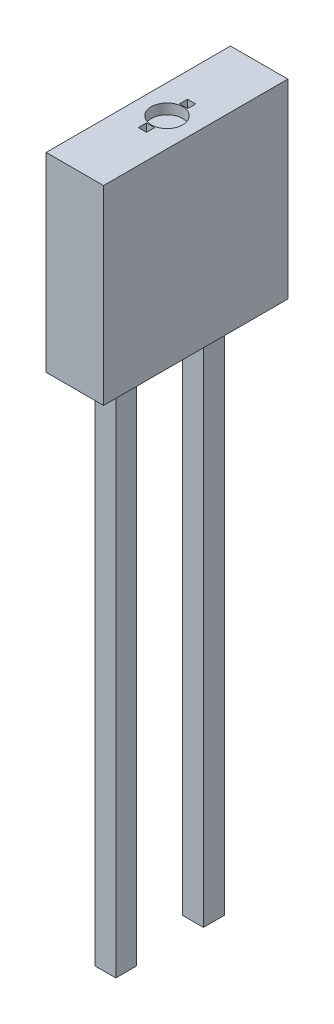
ISO-10303-21;
HEADER;
FILE_DESCRIPTION(('STEP AP214'),'2;1');
FILE_NAME('part.step','',(''),(''),'','','');
FILE_SCHEMA(('AUTOMOTIVE_DESIGN { 1 0 10303 214 1 1 1 1 }'));
ENDSEC;
DATA;
#1=APPLICATION_CONTEXT('core data for automotive mechanical design processes');
#2=APPLICATION_PROTOCOL_DEFINITION('international standard','automotive_design',2000,#1);
#3=PRODUCT_CONTEXT('',#1,'mechanical');
#4=PRODUCT('Part','Part','',(#3));
#5=PRODUCT_RELATED_PRODUCT_CATEGORY('part','',(#4));
#6=PRODUCT_DEFINITION_FORMATION('','',#4);
#7=PRODUCT_DEFINITION_CONTEXT('part definition',#1,'design');
#8=PRODUCT_DEFINITION('design','',#6,#7);
#9=PRODUCT_DEFINITION_SHAPE('','',#8);
#10=(LENGTH_UNIT() NAMED_UNIT(*) SI_UNIT(.MILLI.,.METRE.));
#11=(NAMED_UNIT(*) PLANE_ANGLE_UNIT() SI_UNIT($,.RADIAN.));
#12=(NAMED_UNIT(*) SI_UNIT($,.STERADIAN.) SOLID_ANGLE_UNIT());
#13=UNCERTAINTY_MEASURE_WITH_UNIT(LENGTH_MEASURE(1.E-05),#10,'distance_accuracy_value','');
#14=(GEOMETRIC_REPRESENTATION_CONTEXT(3) GLOBAL_UNCERTAINTY_ASSIGNED_CONTEXT((#13)) GLOBAL_UNIT_ASSIGNED_CONTEXT((#10,
#11,#12)) REPRESENTATION_CONTEXT('',''));
#15=CARTESIAN_POINT('',(0.,0.,0.));
#16=DIRECTION('',(0.,0.,1.));
#17=DIRECTION('',(1.,0.,0.));
#18=AXIS2_PLACEMENT_3D('',#15,#16,#17);
#19=CARTESIAN_POINT('',(-1.39999999999999,0.,4.5));
#20=DIRECTION('',(0.,1.,0.));
#21=DIRECTION('',(0.,0.,1.));
#22=AXIS2_PLACEMENT_3D('',#19,#20,#21);
#23=PLANE('',#22);
#24=DIRECTION('',(0.,0.,-1.));
#25=VECTOR('',#24,1.);
#26=CARTESIAN_POINT('',(-0.954999999999984,0.,3.755));
#27=LINE('',#26,#25);
#28=CARTESIAN_POINT('',(-0.954999999999984,0.,3.755));
#29=VERTEX_POINT('',#28);
#30=CARTESIAN_POINT('',(-0.954999999999984,0.,3.245));
#31=VERTEX_POINT('',#30);
#32=EDGE_CURVE('E193',#29,#31,#27,.T.);
#33=ORIENTED_EDGE('',*,*,#32,.F.);
#34=DIRECTION('',(-1.,0.,0.));
#35=VECTOR('',#34,1.);
#36=CARTESIAN_POINT('',(-0.444999999999987,0.,3.755));
#37=LINE('',#36,#35);
#38=CARTESIAN_POINT('',(-0.444999999999987,0.,3.755));
#39=VERTEX_POINT('',#38);
#40=EDGE_CURVE('E206',#39,#29,#37,.T.);
#41=ORIENTED_EDGE('',*,*,#40,.F.);
#42=DIRECTION('',(0.,0.,1.));
#43=VECTOR('',#42,1.);
#44=CARTESIAN_POINT('',(-0.444999999999987,0.,3.755));
#45=LINE('',#44,#43);
#46=CARTESIAN_POINT('',(-0.444999999999987,0.,3.245));
#47=VERTEX_POINT('',#46);
#48=EDGE_CURVE('E215',#47,#39,#45,.T.);
#49=ORIENTED_EDGE('',*,*,#48,.F.);
#50=DIRECTION('',(1.,0.,0.));
#51=VECTOR('',#50,1.);
#52=CARTESIAN_POINT('',(-0.444999999999987,0.,3.245));
#53=LINE('',#52,#51);
#54=EDGE_CURVE('E196',#31,#47,#53,.T.);
#55=ORIENTED_EDGE('',*,*,#54,.F.);
#56=EDGE_LOOP('',(#33,#41,#49,#55));
#57=FACE_BOUND('',#56,.T.);
#58=DIRECTION('',(0.,0.,1.));
#59=VECTOR('',#58,1.);
#60=CARTESIAN_POINT('',(-1.39999999999999,0.,0.));
#61=LINE('',#60,#59);
#62=CARTESIAN_POINT('',(-1.39999999999999,0.,0.));
#63=VERTEX_POINT('',#62);
#64=CARTESIAN_POINT('',(-1.39999999999999,0.,4.5));
#65=VERTEX_POINT('',#64);
#66=EDGE_CURVE('E299',#63,#65,#61,.T.);
#67=ORIENTED_EDGE('',*,*,#66,.F.);
#68=DIRECTION('',(-1.,0.,0.));
#69=VECTOR('',#68,1.);
#70=CARTESIAN_POINT('',(-1.39999999999999,0.,0.));
#71=LINE('',#70,#69);
#72=CARTESIAN_POINT('',(0.,0.,0.));
#73=VERTEX_POINT('',#72);
#74=EDGE_CURVE('E306',#73,#63,#71,.T.);
#75=ORIENTED_EDGE('',*,*,#74,.F.);
#76=DIRECTION('',(0.,0.,-1.));
#77=VECTOR('',#76,1.);
#78=CARTESIAN_POINT('',(0.,0.,0.));
#79=LINE('',#78,#77);
#80=CARTESIAN_POINT('',(0.,0.,4.5));
#81=VERTEX_POINT('',#80);
#82=EDGE_CURVE('E317',#81,#73,#79,.T.);
#83=ORIENTED_EDGE('',*,*,#82,.F.);
#84=DIRECTION('',(1.,0.,0.));
#85=VECTOR('',#84,1.);
#86=CARTESIAN_POINT('',(-1.39999999999999,0.,4.5));
#87=LINE('',#86,#85);
#88=EDGE_CURVE('E315',#65,#81,#87,.T.);
#89=ORIENTED_EDGE('',*,*,#88,.F.);
#90=EDGE_LOOP('',(#67,#75,#83,#89));
#91=FACE_BOUND('',#90,.T.);
#92=DIRECTION('',(0.,0.,-1.));
#93=VECTOR('',#92,1.);
#94=CARTESIAN_POINT('',(-0.954999999999984,0.,1.10633889836995));
#95=LINE('',#94,#93);
#96=CARTESIAN_POINT('',(-0.954999999999987,0.,1.61633889836995));
#97=VERTEX_POINT('',#96);
#98=CARTESIAN_POINT('',(-0.954999999999984,0.,1.10633889836995));
#99=VERTEX_POINT('',#98);
#100=EDGE_CURVE('E192',#97,#99,#95,.T.);
#101=ORIENTED_EDGE('',*,*,#100,.F.);
#102=DIRECTION('',(-1.,0.,0.));
#103=VECTOR('',#102,1.);
#104=CARTESIAN_POINT('',(-0.444999999999987,0.,1.61633889836995));
#105=LINE('',#104,#103);
#106=CARTESIAN_POINT('',(-0.444999999999987,0.,1.61633889836995));
#107=VERTEX_POINT('',#106);
#108=EDGE_CURVE('E189',#107,#97,#105,.T.);
#109=ORIENTED_EDGE('',*,*,#108,.F.);
#110=DIRECTION('',(0.,0.,1.));
#111=VECTOR('',#110,1.);
#112=CARTESIAN_POINT('',(-0.444999999999987,0.,1.10633889836995));
#113=LINE('',#112,#111);
#114=CARTESIAN_POINT('',(-0.444999999999987,0.,1.10633889836995));
#115=VERTEX_POINT('',#114);
#116=EDGE_CURVE('E55',#115,#107,#113,.T.);
#117=ORIENTED_EDGE('',*,*,#116,.F.);
#118=DIRECTION('',(1.,0.,0.));
#119=VECTOR('',#118,1.);
#120=CARTESIAN_POINT('',(-0.444999999999987,0.,1.10633889836995));
#121=LINE('',#120,#119);
#122=EDGE_CURVE('E50',#99,#115,#121,.T.);
#123=ORIENTED_EDGE('',*,*,#122,.F.);
#124=EDGE_LOOP('',(#101,#109,#117,#123));
#125=FACE_BOUND('',#124,.T.);
#126=ADVANCED_FACE('F35',(#57,#91,#125),#23,.F.);
#127=CARTESIAN_POINT('',(-1.39999999999999,4.65,0.));
#128=DIRECTION('',(1.,0.,0.));
#129=DIRECTION('',(0.,0.,-1.));
#130=AXIS2_PLACEMENT_3D('',#127,#128,#129);
#131=PLANE('',#130);
#132=ORIENTED_EDGE('',*,*,#66,.T.);
#133=DIRECTION('',(0.,-1.,0.));
#134=VECTOR('',#133,1.);
#135=CARTESIAN_POINT('',(-1.39999999999999,4.65,4.5));
#136=LINE('',#135,#134);
#137=CARTESIAN_POINT('',(-1.39999999999999,4.65,4.5));
#138=VERTEX_POINT('',#137);
#139=EDGE_CURVE('E11',#138,#65,#136,.T.);
#140=ORIENTED_EDGE('',*,*,#139,.F.);
#141=DIRECTION('',(0.,0.,1.));
#142=VECTOR('',#141,1.);
#143=CARTESIAN_POINT('',(-1.39999999999999,4.65,0.));
#144=LINE('',#143,#142);
#145=CARTESIAN_POINT('',(-1.39999999999999,4.65,0.));
#146=VERTEX_POINT('',#145);
#147=EDGE_CURVE('E302',#146,#138,#144,.T.);
#148=ORIENTED_EDGE('',*,*,#147,.F.);
#149=DIRECTION('',(0.,-1.,0.));
#150=VECTOR('',#149,1.);
#151=CARTESIAN_POINT('',(-1.39999999999999,4.65,0.));
#152=LINE('',#151,#150);
#153=EDGE_CURVE('E312',#146,#63,#152,.T.);
#154=ORIENTED_EDGE('',*,*,#153,.T.);
#155=EDGE_LOOP('',(#132,#140,#148,#154));
#156=FACE_BOUND('',#155,.T.);
#157=ADVANCED_FACE('F37',(#156),#131,.F.);
#158=CARTESIAN_POINT('',(-1.39999999999999,4.65,4.5));
#159=DIRECTION('',(0.,0.,-1.));
#160=DIRECTION('',(-1.,0.,0.));
#161=AXIS2_PLACEMENT_3D('',#158,#159,#160);
#162=PLANE('',#161);
#163=ORIENTED_EDGE('',*,*,#88,.T.);
#164=DIRECTION('',(0.,-1.,0.));
#165=VECTOR('',#164,1.);
#166=CARTESIAN_POINT('',(0.,4.65,4.5));
#167=LINE('',#166,#165);
#168=CARTESIAN_POINT('',(0.,4.65,4.5));
#169=VERTEX_POINT('',#168);
#170=EDGE_CURVE('E43',#169,#81,#167,.T.);
#171=ORIENTED_EDGE('',*,*,#170,.F.);
#172=DIRECTION('',(1.,0.,0.));
#173=VECTOR('',#172,1.);
#174=CARTESIAN_POINT('',(-1.39999999999999,4.65,4.5));
#175=LINE('',#174,#173);
#176=EDGE_CURVE('E305',#138,#169,#175,.T.);
#177=ORIENTED_EDGE('',*,*,#176,.F.);
#178=ORIENTED_EDGE('',*,*,#139,.T.);
#179=EDGE_LOOP('',(#163,#171,#177,#178));
#180=FACE_BOUND('',#179,.T.);
#181=ADVANCED_FACE('F344',(#180),#162,.F.);
#182=CARTESIAN_POINT('',(0.,4.65,0.));
#183=DIRECTION('',(-1.,0.,0.));
#184=DIRECTION('',(0.,0.,1.));
#185=AXIS2_PLACEMENT_3D('',#182,#183,#184);
#186=PLANE('',#185);
#187=ORIENTED_EDGE('',*,*,#82,.T.);
#188=DIRECTION('',(0.,-1.,0.));
#189=VECTOR('',#188,1.);
#190=CARTESIAN_POINT('',(0.,4.65,0.));
#191=LINE('',#190,#189);
#192=CARTESIAN_POINT('',(0.,4.65,0.));
#193=VERTEX_POINT('',#192);
#194=EDGE_CURVE('E322',#193,#73,#191,.T.);
#195=ORIENTED_EDGE('',*,*,#194,.F.);
#196=DIRECTION('',(0.,0.,-1.));
#197=VECTOR('',#196,1.);
#198=CARTESIAN_POINT('',(0.,4.65,0.));
#199=LINE('',#198,#197);
#200=EDGE_CURVE('E308',#169,#193,#199,.T.);
#201=ORIENTED_EDGE('',*,*,#200,.F.);
#202=ORIENTED_EDGE('',*,*,#170,.T.);
#203=EDGE_LOOP('',(#187,#195,#201,#202));
#204=FACE_BOUND('',#203,.T.);
#205=ADVANCED_FACE('F329',(#204),#186,.F.);
#206=CARTESIAN_POINT('',(-1.39999999999999,4.65,0.));
#207=DIRECTION('',(0.,0.,1.));
#208=DIRECTION('',(1.,0.,0.));
#209=AXIS2_PLACEMENT_3D('',#206,#207,#208);
#210=PLANE('',#209);
#211=ORIENTED_EDGE('',*,*,#74,.T.);
#212=ORIENTED_EDGE('',*,*,#153,.F.);
#213=DIRECTION('',(-1.,0.,0.));
#214=VECTOR('',#213,1.);
#215=CARTESIAN_POINT('',(-1.39999999999999,4.65,0.));
#216=LINE('',#215,#214);
#217=EDGE_CURVE('E310',#193,#146,#216,.T.);
#218=ORIENTED_EDGE('',*,*,#217,.F.);
#219=ORIENTED_EDGE('',*,*,#194,.T.);
#220=EDGE_LOOP('',(#211,#212,#218,#219));
#221=FACE_BOUND('',#220,.T.);
#222=ADVANCED_FACE('F337',(#221),#210,.F.);
#223=CARTESIAN_POINT('',(-1.39999999999999,4.65,4.5));
#224=DIRECTION('',(0.,1.,0.));
#225=DIRECTION('',(0.,0.,1.));
#226=AXIS2_PLACEMENT_3D('',#223,#224,#225);
#227=PLANE('',#226);
#228=DIRECTION('',(1.,0.,0.));
#229=VECTOR('',#228,1.);
#230=CARTESIAN_POINT('',(-0.799999999999992,4.65,2.85));
#231=LINE('',#230,#229);
#232=CARTESIAN_POINT('',(-0.799999999999992,4.65,2.85));
#233=VERTEX_POINT('',#232);
#234=CARTESIAN_POINT('',(-0.599999999999993,4.65,2.85));
#235=VERTEX_POINT('',#234);
#236=EDGE_CURVE('E231',#233,#235,#231,.T.);
#237=ORIENTED_EDGE('',*,*,#236,.F.);
#238=DIRECTION('',(0.,0.,1.));
#239=VECTOR('',#238,1.);
#240=CARTESIAN_POINT('',(-0.799999999999992,4.65,2.85));
#241=LINE('',#240,#239);
#242=CARTESIAN_POINT('',(-0.799999999999992,4.65,2.65));
#243=VERTEX_POINT('',#242);
#244=EDGE_CURVE('E236',#243,#233,#241,.T.);
#245=ORIENTED_EDGE('',*,*,#244,.F.);
#246=DIRECTION('',(-1.,0.,0.));
#247=VECTOR('',#246,1.);
#248=CARTESIAN_POINT('',(-0.799999999999992,4.65,2.65));
#249=LINE('',#248,#247);
#250=CARTESIAN_POINT('',(-0.599999999999993,4.65,2.65));
#251=VERTEX_POINT('',#250);
#252=EDGE_CURVE('E250',#251,#243,#249,.T.);
#253=ORIENTED_EDGE('',*,*,#252,.F.);
#254=DIRECTION('',(0.,0.,-1.));
#255=VECTOR('',#254,1.);
#256=CARTESIAN_POINT('',(-0.599999999999993,4.65,2.85));
#257=LINE('',#256,#255);
#258=EDGE_CURVE('E247',#235,#251,#257,.T.);
#259=ORIENTED_EDGE('',*,*,#258,.F.);
#260=EDGE_LOOP('',(#237,#245,#253,#259));
#261=FACE_BOUND('',#260,.T.);
#262=DIRECTION('',(-1.,0.,0.));
#263=VECTOR('',#262,1.);
#264=CARTESIAN_POINT('',(-0.799999999999999,4.65,1.65));
#265=LINE('',#264,#263);
#266=CARTESIAN_POINT('',(-0.6,4.65,1.65000000000001));
#267=VERTEX_POINT('',#266);
#268=CARTESIAN_POINT('',(-0.799999999999999,4.65,1.65));
#269=VERTEX_POINT('',#268);
#270=EDGE_CURVE('E257',#267,#269,#265,.T.);
#271=ORIENTED_EDGE('',*,*,#270,.F.);
#272=DIRECTION('',(0.,0.,-1.));
#273=VECTOR('',#272,1.);
#274=CARTESIAN_POINT('',(-0.6,4.65,1.65000000000001));
#275=LINE('',#274,#273);
#276=CARTESIAN_POINT('',(-0.6,4.65,1.85));
#277=VERTEX_POINT('',#276);
#278=EDGE_CURVE('E268',#277,#267,#275,.T.);
#279=ORIENTED_EDGE('',*,*,#278,.F.);
#280=DIRECTION('',(1.,0.,0.));
#281=VECTOR('',#280,1.);
#282=CARTESIAN_POINT('',(-0.799999999999999,4.65,1.85));
#283=LINE('',#282,#281);
#284=CARTESIAN_POINT('',(-0.799999999999999,4.65,1.85));
#285=VERTEX_POINT('',#284);
#286=EDGE_CURVE('E282',#285,#277,#283,.T.);
#287=ORIENTED_EDGE('',*,*,#286,.F.);
#288=DIRECTION('',(0.,0.,1.));
#289=VECTOR('',#288,1.);
#290=CARTESIAN_POINT('',(-0.799999999999999,4.65,1.65));
#291=LINE('',#290,#289);
#292=EDGE_CURVE('E279',#269,#285,#291,.T.);
#293=ORIENTED_EDGE('',*,*,#292,.F.);
#294=EDGE_LOOP('',(#271,#279,#287,#293));
#295=FACE_BOUND('',#294,.T.);
#296=CARTESIAN_POINT('',(-0.699999999999996,4.65,2.25));
#297=DIRECTION('',(0.,1.,0.));
#298=DIRECTION('',(0.,0.,1.));
#299=AXIS2_PLACEMENT_3D('',#296,#297,#298);
#300=CIRCLE('',#299,0.383471957802925);
#301=CARTESIAN_POINT('',(-0.699999999999996,4.65,2.63347195780293));
#302=VERTEX_POINT('',#301);
#303=EDGE_CURVE('E289',#302,#302,#300,.T.);
#304=ORIENTED_EDGE('',*,*,#303,.F.);
#305=EDGE_LOOP('',(#304));
#306=FACE_BOUND('',#305,.T.);
#307=ORIENTED_EDGE('',*,*,#147,.T.);
#308=ORIENTED_EDGE('',*,*,#176,.T.);
#309=ORIENTED_EDGE('',*,*,#200,.T.);
#310=ORIENTED_EDGE('',*,*,#217,.T.);
#311=EDGE_LOOP('',(#307,#308,#309,#310));
#312=FACE_BOUND('',#311,.T.);
#313=ADVANCED_FACE('F343',(#261,#295,#306,#312),#227,.T.);
#314=CARTESIAN_POINT('',(-0.699999999999996,4.4,2.25));
#315=DIRECTION('',(0.,1.,0.));
#316=DIRECTION('',(0.,0.,1.));
#317=AXIS2_PLACEMENT_3D('',#314,#315,#316);
#318=CYLINDRICAL_SURFACE('',#317,0.383471957802925);
#319=CARTESIAN_POINT('',(-0.699999999999996,4.4,2.25));
#320=DIRECTION('',(0.,1.,0.));
#321=DIRECTION('',(0.,0.,1.));
#322=AXIS2_PLACEMENT_3D('',#319,#320,#321);
#323=CIRCLE('',#322,0.383471957802925);
#324=CARTESIAN_POINT('',(-0.699999999999996,4.4,2.63347195780293));
#325=VERTEX_POINT('',#324);
#326=EDGE_CURVE('E296',#325,#325,#323,.T.);
#327=ORIENTED_EDGE('',*,*,#326,.F.);
#328=EDGE_LOOP('',(#327));
#329=FACE_BOUND('',#328,.T.);
#330=ORIENTED_EDGE('',*,*,#303,.T.);
#331=EDGE_LOOP('',(#330));
#332=FACE_BOUND('',#331,.T.);
#333=ADVANCED_FACE('F363',(#329,#332),#318,.F.);
#334=CARTESIAN_POINT('',(-0.699999999999996,4.4,2.25));
#335=DIRECTION('',(0.,1.,0.));
#336=DIRECTION('',(0.,0.,1.));
#337=AXIS2_PLACEMENT_3D('',#334,#335,#336);
#338=PLANE('',#337);
#339=ORIENTED_EDGE('',*,*,#326,.T.);
#340=EDGE_LOOP('',(#339));
#341=FACE_BOUND('',#340,.T.);
#342=ADVANCED_FACE('F368',(#341),#338,.T.);
#343=CARTESIAN_POINT('',(-0.799999999999999,4.4,1.65));
#344=DIRECTION('',(0.,0.,-1.));
#345=DIRECTION('',(-1.,0.,0.));
#346=AXIS2_PLACEMENT_3D('',#343,#344,#345);
#347=PLANE('',#346);
#348=ORIENTED_EDGE('',*,*,#270,.T.);
#349=DIRECTION('',(0.,1.,0.));
#350=VECTOR('',#349,1.);
#351=CARTESIAN_POINT('',(-0.799999999999999,4.4,1.65));
#352=LINE('',#351,#350);
#353=CARTESIAN_POINT('',(-0.799999999999999,4.4,1.65));
#354=VERTEX_POINT('',#353);
#355=EDGE_CURVE('E277',#354,#269,#352,.T.);
#356=ORIENTED_EDGE('',*,*,#355,.F.);
#357=DIRECTION('',(-1.,0.,0.));
#358=VECTOR('',#357,1.);
#359=CARTESIAN_POINT('',(-0.799999999999999,4.4,1.65));
#360=LINE('',#359,#358);
#361=CARTESIAN_POINT('',(-0.6,4.4,1.65000000000001));
#362=VERTEX_POINT('',#361);
#363=EDGE_CURVE('E264',#362,#354,#360,.T.);
#364=ORIENTED_EDGE('',*,*,#363,.F.);
#365=DIRECTION('',(0.,1.,0.));
#366=VECTOR('',#365,1.);
#367=CARTESIAN_POINT('',(-0.6,4.4,1.65000000000001));
#368=LINE('',#367,#366);
#369=EDGE_CURVE('E287',#362,#267,#368,.T.);
#370=ORIENTED_EDGE('',*,*,#369,.T.);
#371=EDGE_LOOP('',(#348,#356,#364,#370));
#372=FACE_BOUND('',#371,.T.);
#373=ADVANCED_FACE('F382',(#372),#347,.F.);
#374=CARTESIAN_POINT('',(-0.6,4.4,1.65000000000001));
#375=DIRECTION('',(1.,0.,0.));
#376=DIRECTION('',(0.,0.,-1.));
#377=AXIS2_PLACEMENT_3D('',#374,#375,#376);
#378=PLANE('',#377);
#379=ORIENTED_EDGE('',*,*,#278,.T.);
#380=ORIENTED_EDGE('',*,*,#369,.F.);
#381=DIRECTION('',(0.,0.,-1.));
#382=VECTOR('',#381,1.);
#383=CARTESIAN_POINT('',(-0.6,4.4,1.65000000000001));
#384=LINE('',#383,#382);
#385=CARTESIAN_POINT('',(-0.6,4.4,1.85));
#386=VERTEX_POINT('',#385);
#387=EDGE_CURVE('E274',#386,#362,#384,.T.);
#388=ORIENTED_EDGE('',*,*,#387,.F.);
#389=DIRECTION('',(0.,1.,0.));
#390=VECTOR('',#389,1.);
#391=CARTESIAN_POINT('',(-0.6,4.4,1.85));
#392=LINE('',#391,#390);
#393=EDGE_CURVE('E290',#386,#277,#392,.T.);
#394=ORIENTED_EDGE('',*,*,#393,.T.);
#395=EDGE_LOOP('',(#379,#380,#388,#394));
#396=FACE_BOUND('',#395,.T.);
#397=ADVANCED_FACE('F392',(#396),#378,.F.);
#398=CARTESIAN_POINT('',(-0.799999999999999,4.4,1.85));
#399=DIRECTION('',(0.,0.,1.));
#400=DIRECTION('',(1.,0.,0.));
#401=AXIS2_PLACEMENT_3D('',#398,#399,#400);
#402=PLANE('',#401);
#403=ORIENTED_EDGE('',*,*,#286,.T.);
#404=ORIENTED_EDGE('',*,*,#393,.F.);
#405=DIRECTION('',(1.,0.,0.));
#406=VECTOR('',#405,1.);
#407=CARTESIAN_POINT('',(-0.799999999999999,4.4,1.85));
#408=LINE('',#407,#406);
#409=CARTESIAN_POINT('',(-0.799999999999999,4.4,1.85));
#410=VERTEX_POINT('',#409);
#411=EDGE_CURVE('E271',#410,#386,#408,.T.);
#412=ORIENTED_EDGE('',*,*,#411,.F.);
#413=DIRECTION('',(0.,1.,0.));
#414=VECTOR('',#413,1.);
#415=CARTESIAN_POINT('',(-0.799999999999999,4.4,1.85));
#416=LINE('',#415,#414);
#417=EDGE_CURVE('E292',#410,#285,#416,.T.);
#418=ORIENTED_EDGE('',*,*,#417,.T.);
#419=EDGE_LOOP('',(#403,#404,#412,#418));
#420=FACE_BOUND('',#419,.T.);
#421=ADVANCED_FACE('F394',(#420),#402,.F.);
#422=CARTESIAN_POINT('',(-0.799999999999999,4.4,1.65));
#423=DIRECTION('',(-1.,0.,0.));
#424=DIRECTION('',(0.,0.,1.));
#425=AXIS2_PLACEMENT_3D('',#422,#423,#424);
#426=PLANE('',#425);
#427=ORIENTED_EDGE('',*,*,#292,.T.);
#428=ORIENTED_EDGE('',*,*,#417,.F.);
#429=DIRECTION('',(0.,0.,1.));
#430=VECTOR('',#429,1.);
#431=CARTESIAN_POINT('',(-0.799999999999999,4.4,1.65));
#432=LINE('',#431,#430);
#433=EDGE_CURVE('E267',#354,#410,#432,.T.);
#434=ORIENTED_EDGE('',*,*,#433,.F.);
#435=ORIENTED_EDGE('',*,*,#355,.T.);
#436=EDGE_LOOP('',(#427,#428,#434,#435));
#437=FACE_BOUND('',#436,.T.);
#438=ADVANCED_FACE('F386',(#437),#426,.F.);
#439=CARTESIAN_POINT('',(-0.6,4.4,1.65000000000001));
#440=DIRECTION('',(0.,-1.,0.));
#441=DIRECTION('',(0.,0.,-1.));
#442=AXIS2_PLACEMENT_3D('',#439,#440,#441);
#443=PLANE('',#442);
#444=ORIENTED_EDGE('',*,*,#363,.T.);
#445=ORIENTED_EDGE('',*,*,#433,.T.);
#446=ORIENTED_EDGE('',*,*,#411,.T.);
#447=ORIENTED_EDGE('',*,*,#387,.T.);
#448=EDGE_LOOP('',(#444,#445,#446,#447));
#449=FACE_BOUND('',#448,.T.);
#450=ADVANCED_FACE('F389',(#449),#443,.F.);
#451=CARTESIAN_POINT('',(-0.799999999999992,4.4,2.85));
#452=DIRECTION('',(0.,0.,1.));
#453=DIRECTION('',(1.,0.,0.));
#454=AXIS2_PLACEMENT_3D('',#451,#452,#453);
#455=PLANE('',#454);
#456=ORIENTED_EDGE('',*,*,#236,.T.);
#457=DIRECTION('',(0.,1.,0.));
#458=VECTOR('',#457,1.);
#459=CARTESIAN_POINT('',(-0.599999999999993,4.4,2.85));
#460=LINE('',#459,#458);
#461=CARTESIAN_POINT('',(-0.599999999999993,4.4,2.85));
#462=VERTEX_POINT('',#461);
#463=EDGE_CURVE('E245',#462,#235,#460,.T.);
#464=ORIENTED_EDGE('',*,*,#463,.F.);
#465=DIRECTION('',(1.,0.,0.));
#466=VECTOR('',#465,1.);
#467=CARTESIAN_POINT('',(-0.799999999999992,4.4,2.85));
#468=LINE('',#467,#466);
#469=CARTESIAN_POINT('',(-0.799999999999992,4.4,2.85));
#470=VERTEX_POINT('',#469);
#471=EDGE_CURVE('E232',#470,#462,#468,.T.);
#472=ORIENTED_EDGE('',*,*,#471,.F.);
#473=DIRECTION('',(0.,1.,0.));
#474=VECTOR('',#473,1.);
#475=CARTESIAN_POINT('',(-0.799999999999992,4.4,2.85));
#476=LINE('',#475,#474);
#477=EDGE_CURVE('E255',#470,#233,#476,.T.);
#478=ORIENTED_EDGE('',*,*,#477,.T.);
#479=EDGE_LOOP('',(#456,#464,#472,#478));
#480=FACE_BOUND('',#479,.T.);
#481=ADVANCED_FACE('F441',(#480),#455,.F.);
#482=CARTESIAN_POINT('',(-0.799999999999992,4.4,2.85));
#483=DIRECTION('',(-1.,0.,0.));
#484=DIRECTION('',(0.,0.,1.));
#485=AXIS2_PLACEMENT_3D('',#482,#483,#484);
#486=PLANE('',#485);
#487=ORIENTED_EDGE('',*,*,#244,.T.);
#488=ORIENTED_EDGE('',*,*,#477,.F.);
#489=DIRECTION('',(0.,0.,1.));
#490=VECTOR('',#489,1.);
#491=CARTESIAN_POINT('',(-0.799999999999992,4.4,2.85));
#492=LINE('',#491,#490);
#493=CARTESIAN_POINT('',(-0.799999999999992,4.4,2.65));
#494=VERTEX_POINT('',#493);
#495=EDGE_CURVE('E242',#494,#470,#492,.T.);
#496=ORIENTED_EDGE('',*,*,#495,.F.);
#497=DIRECTION('',(0.,1.,0.));
#498=VECTOR('',#497,1.);
#499=CARTESIAN_POINT('',(-0.799999999999992,4.4,2.65));
#500=LINE('',#499,#498);
#501=EDGE_CURVE('E258',#494,#243,#500,.T.);
#502=ORIENTED_EDGE('',*,*,#501,.T.);
#503=EDGE_LOOP('',(#487,#488,#496,#502));
#504=FACE_BOUND('',#503,.T.);
#505=ADVANCED_FACE('F449',(#504),#486,.F.);
#506=CARTESIAN_POINT('',(-0.799999999999992,4.4,2.65));
#507=DIRECTION('',(0.,0.,-1.));
#508=DIRECTION('',(-1.,0.,0.));
#509=AXIS2_PLACEMENT_3D('',#506,#507,#508);
#510=PLANE('',#509);
#511=ORIENTED_EDGE('',*,*,#252,.T.);
#512=ORIENTED_EDGE('',*,*,#501,.F.);
#513=DIRECTION('',(-1.,0.,0.));
#514=VECTOR('',#513,1.);
#515=CARTESIAN_POINT('',(-0.799999999999992,4.4,2.65));
#516=LINE('',#515,#514);
#517=CARTESIAN_POINT('',(-0.599999999999993,4.4,2.65));
#518=VERTEX_POINT('',#517);
#519=EDGE_CURVE('E239',#518,#494,#516,.T.);
#520=ORIENTED_EDGE('',*,*,#519,.F.);
#521=DIRECTION('',(0.,1.,0.));
#522=VECTOR('',#521,1.);
#523=CARTESIAN_POINT('',(-0.599999999999993,4.4,2.65));
#524=LINE('',#523,#522);
#525=EDGE_CURVE('E260',#518,#251,#524,.T.);
#526=ORIENTED_EDGE('',*,*,#525,.T.);
#527=EDGE_LOOP('',(#511,#512,#520,#526));
#528=FACE_BOUND('',#527,.T.);
#529=ADVANCED_FACE('F459',(#528),#510,.F.);
#530=CARTESIAN_POINT('',(-0.599999999999993,4.4,2.85));
#531=DIRECTION('',(1.,0.,0.));
#532=DIRECTION('',(0.,0.,-1.));
#533=AXIS2_PLACEMENT_3D('',#530,#531,#532);
#534=PLANE('',#533);
#535=ORIENTED_EDGE('',*,*,#258,.T.);
#536=ORIENTED_EDGE('',*,*,#525,.F.);
#537=DIRECTION('',(0.,0.,-1.));
#538=VECTOR('',#537,1.);
#539=CARTESIAN_POINT('',(-0.599999999999993,4.4,2.85));
#540=LINE('',#539,#538);
#541=EDGE_CURVE('E235',#462,#518,#540,.T.);
#542=ORIENTED_EDGE('',*,*,#541,.F.);
#543=ORIENTED_EDGE('',*,*,#463,.T.);
#544=EDGE_LOOP('',(#535,#536,#542,#543));
#545=FACE_BOUND('',#544,.T.);
#546=ADVANCED_FACE('F469',(#545),#534,.F.);
#547=CARTESIAN_POINT('',(-0.599999999999993,4.4,2.85));
#548=DIRECTION('',(0.,1.,0.));
#549=DIRECTION('',(0.,0.,1.));
#550=AXIS2_PLACEMENT_3D('',#547,#548,#549);
#551=PLANE('',#550);
#552=ORIENTED_EDGE('',*,*,#471,.T.);
#553=ORIENTED_EDGE('',*,*,#541,.T.);
#554=ORIENTED_EDGE('',*,*,#519,.T.);
#555=ORIENTED_EDGE('',*,*,#495,.T.);
#556=EDGE_LOOP('',(#552,#553,#554,#555));
#557=FACE_BOUND('',#556,.T.);
#558=ADVANCED_FACE('F479',(#557),#551,.T.);
#559=CARTESIAN_POINT('',(-0.954999999999984,-12.7,3.755));
#560=DIRECTION('',(1.,0.,0.));
#561=DIRECTION('',(0.,0.,-1.));
#562=AXIS2_PLACEMENT_3D('',#559,#560,#561);
#563=PLANE('',#562);
#564=ORIENTED_EDGE('',*,*,#32,.T.);
#565=DIRECTION('',(0.,1.,0.));
#566=VECTOR('',#565,1.);
#567=CARTESIAN_POINT('',(-0.954999999999984,-12.7,3.245));
#568=LINE('',#567,#566);
#569=CARTESIAN_POINT('',(-0.954999999999984,-12.7,3.245));
#570=VERTEX_POINT('',#569);
#571=EDGE_CURVE('E228',#570,#31,#568,.T.);
#572=ORIENTED_EDGE('',*,*,#571,.F.);
#573=DIRECTION('',(0.,0.,-1.));
#574=VECTOR('',#573,1.);
#575=CARTESIAN_POINT('',(-0.954999999999984,-12.7,3.755));
#576=LINE('',#575,#574);
#577=CARTESIAN_POINT('',(-0.954999999999984,-12.7,3.755));
#578=VERTEX_POINT('',#577);
#579=EDGE_CURVE('E202',#578,#570,#576,.T.);
#580=ORIENTED_EDGE('',*,*,#579,.F.);
#581=DIRECTION('',(0.,1.,0.));
#582=VECTOR('',#581,1.);
#583=CARTESIAN_POINT('',(-0.954999999999984,-12.7,3.755));
#584=LINE('',#583,#582);
#585=EDGE_CURVE('E211',#578,#29,#584,.T.);
#586=ORIENTED_EDGE('',*,*,#585,.T.);
#587=EDGE_LOOP('',(#564,#572,#580,#586));
#588=FACE_BOUND('',#587,.T.);
#589=ADVANCED_FACE('F488',(#588),#563,.F.);
#590=CARTESIAN_POINT('',(-0.444999999999987,-12.7,3.245));
#591=DIRECTION('',(0.,0.,1.));
#592=DIRECTION('',(1.,0.,0.));
#593=AXIS2_PLACEMENT_3D('',#590,#591,#592);
#594=PLANE('',#593);
#595=ORIENTED_EDGE('',*,*,#54,.T.);
#596=DIRECTION('',(0.,1.,0.));
#597=VECTOR('',#596,1.);
#598=CARTESIAN_POINT('',(-0.444999999999987,-12.7,3.245));
#599=LINE('',#598,#597);
#600=CARTESIAN_POINT('',(-0.444999999999987,-12.7,3.245));
#601=VERTEX_POINT('',#600);
#602=EDGE_CURVE('E225',#601,#47,#599,.T.);
#603=ORIENTED_EDGE('',*,*,#602,.F.);
#604=DIRECTION('',(1.,0.,0.));
#605=VECTOR('',#604,1.);
#606=CARTESIAN_POINT('',(-0.444999999999987,-12.7,3.245));
#607=LINE('',#606,#605);
#608=EDGE_CURVE('E205',#570,#601,#607,.T.);
#609=ORIENTED_EDGE('',*,*,#608,.F.);
#610=ORIENTED_EDGE('',*,*,#571,.T.);
#611=EDGE_LOOP('',(#595,#603,#609,#610));
#612=FACE_BOUND('',#611,.T.);
#613=ADVANCED_FACE('F503',(#612),#594,.F.);
#614=CARTESIAN_POINT('',(-0.444999999999987,-12.7,3.755));
#615=DIRECTION('',(-1.,0.,0.));
#616=DIRECTION('',(0.,0.,1.));
#617=AXIS2_PLACEMENT_3D('',#614,#615,#616);
#618=PLANE('',#617);
#619=ORIENTED_EDGE('',*,*,#48,.T.);
#620=DIRECTION('',(0.,1.,0.));
#621=VECTOR('',#620,1.);
#622=CARTESIAN_POINT('',(-0.444999999999987,-12.7,3.755));
#623=LINE('',#622,#621);
#624=CARTESIAN_POINT('',(-0.444999999999987,-12.7,3.755));
#625=VERTEX_POINT('',#624);
#626=EDGE_CURVE('E222',#625,#39,#623,.T.);
#627=ORIENTED_EDGE('',*,*,#626,.F.);
#628=DIRECTION('',(0.,0.,1.));
#629=VECTOR('',#628,1.);
#630=CARTESIAN_POINT('',(-0.444999999999987,-12.7,3.755));
#631=LINE('',#630,#629);
#632=EDGE_CURVE('E208',#601,#625,#631,.T.);
#633=ORIENTED_EDGE('',*,*,#632,.F.);
#634=ORIENTED_EDGE('',*,*,#602,.T.);
#635=EDGE_LOOP('',(#619,#627,#633,#634));
#636=FACE_BOUND('',#635,.T.);
#637=ADVANCED_FACE('F513',(#636),#618,.F.);
#638=CARTESIAN_POINT('',(-0.444999999999987,-12.7,3.755));
#639=DIRECTION('',(0.,0.,-1.));
#640=DIRECTION('',(-1.,0.,0.));
#641=AXIS2_PLACEMENT_3D('',#638,#639,#640);
#642=PLANE('',#641);
#643=ORIENTED_EDGE('',*,*,#40,.T.);
#644=ORIENTED_EDGE('',*,*,#585,.F.);
#645=DIRECTION('',(-1.,0.,0.));
#646=VECTOR('',#645,1.);
#647=CARTESIAN_POINT('',(-0.444999999999987,-12.7,3.755));
#648=LINE('',#647,#646);
#649=EDGE_CURVE('E210',#625,#578,#648,.T.);
#650=ORIENTED_EDGE('',*,*,#649,.F.);
#651=ORIENTED_EDGE('',*,*,#626,.T.);
#652=EDGE_LOOP('',(#643,#644,#650,#651));
#653=FACE_BOUND('',#652,.T.);
#654=ADVANCED_FACE('F523',(#653),#642,.F.);
#655=CARTESIAN_POINT('',(-0.954999999999984,-12.7,3.245));
#656=DIRECTION('',(0.,1.,0.));
#657=DIRECTION('',(0.,0.,1.));
#658=AXIS2_PLACEMENT_3D('',#655,#656,#657);
#659=PLANE('',#658);
#660=ORIENTED_EDGE('',*,*,#579,.T.);
#661=ORIENTED_EDGE('',*,*,#608,.T.);
#662=ORIENTED_EDGE('',*,*,#632,.T.);
#663=ORIENTED_EDGE('',*,*,#649,.T.);
#664=EDGE_LOOP('',(#660,#661,#662,#663));
#665=FACE_BOUND('',#664,.T.);
#666=ADVANCED_FACE('F533',(#665),#659,.F.);
#667=CARTESIAN_POINT('',(-0.954999999999984,-12.7,1.10633889836995));
#668=DIRECTION('',(1.,0.,0.));
#669=DIRECTION('',(0.,0.,-1.));
#670=AXIS2_PLACEMENT_3D('',#667,#668,#669);
#671=PLANE('',#670);
#672=ORIENTED_EDGE('',*,*,#100,.T.);
#673=DIRECTION('',(0.,1.,0.));
#674=VECTOR('',#673,1.);
#675=CARTESIAN_POINT('',(-0.954999999999984,-12.7,1.10633889836995));
#676=LINE('',#675,#674);
#677=CARTESIAN_POINT('',(-0.954999999999984,-12.7,1.10633889836995));
#678=VERTEX_POINT('',#677);
#679=EDGE_CURVE('E173',#678,#99,#676,.T.);
#680=ORIENTED_EDGE('',*,*,#679,.F.);
#681=DIRECTION('',(0.,0.,-1.));
#682=VECTOR('',#681,1.);
#683=CARTESIAN_POINT('',(-0.954999999999984,-12.7,1.10633889836995));
#684=LINE('',#683,#682);
#685=CARTESIAN_POINT('',(-0.954999999999987,-12.7,1.61633889836995));
#686=VERTEX_POINT('',#685);
#687=EDGE_CURVE('E180',#686,#678,#684,.T.);
#688=ORIENTED_EDGE('',*,*,#687,.F.);
#689=DIRECTION('',(0.,1.,0.));
#690=VECTOR('',#689,1.);
#691=CARTESIAN_POINT('',(-0.954999999999987,-12.7,1.61633889836995));
#692=LINE('',#691,#690);
#693=EDGE_CURVE('E593',#686,#97,#692,.T.);
#694=ORIENTED_EDGE('',*,*,#693,.T.);
#695=EDGE_LOOP('',(#672,#680,#688,#694));
#696=FACE_BOUND('',#695,.T.);
#697=ADVANCED_FACE('F191',(#696),#671,.F.);
#698=CARTESIAN_POINT('',(-0.444999999999987,-12.7,1.10633889836995));
#699=DIRECTION('',(0.,0.,1.));
#700=DIRECTION('',(1.,0.,0.));
#701=AXIS2_PLACEMENT_3D('',#698,#699,#700);
#702=PLANE('',#701);
#703=ORIENTED_EDGE('',*,*,#122,.T.);
#704=DIRECTION('',(0.,1.,0.));
#705=VECTOR('',#704,1.);
#706=CARTESIAN_POINT('',(-0.444999999999987,-12.7,1.10633889836995));
#707=LINE('',#706,#705);
#708=CARTESIAN_POINT('',(-0.444999999999987,-12.7,1.10633889836995));
#709=VERTEX_POINT('',#708);
#710=EDGE_CURVE('E176',#709,#115,#707,.T.);
#711=ORIENTED_EDGE('',*,*,#710,.F.);
#712=DIRECTION('',(1.,0.,0.));
#713=VECTOR('',#712,1.);
#714=CARTESIAN_POINT('',(-0.444999999999987,-12.7,1.10633889836995));
#715=LINE('',#714,#713);
#716=EDGE_CURVE('E169',#678,#709,#715,.T.);
#717=ORIENTED_EDGE('',*,*,#716,.F.);
#718=ORIENTED_EDGE('',*,*,#679,.T.);
#719=EDGE_LOOP('',(#703,#711,#717,#718));
#720=FACE_BOUND('',#719,.T.);
#721=ADVANCED_FACE('F171',(#720),#702,.F.);
#722=CARTESIAN_POINT('',(-0.444999999999987,-12.7,1.10633889836995));
#723=DIRECTION('',(-1.,0.,0.));
#724=DIRECTION('',(0.,0.,1.));
#725=AXIS2_PLACEMENT_3D('',#722,#723,#724);
#726=PLANE('',#725);
#727=ORIENTED_EDGE('',*,*,#116,.T.);
#728=DIRECTION('',(0.,1.,0.));
#729=VECTOR('',#728,1.);
#730=CARTESIAN_POINT('',(-0.444999999999987,-12.7,1.61633889836995));
#731=LINE('',#730,#729);
#732=CARTESIAN_POINT('',(-0.444999999999987,-12.7,1.61633889836995));
#733=VERTEX_POINT('',#732);
#734=EDGE_CURVE('E198',#733,#107,#731,.T.);
#735=ORIENTED_EDGE('',*,*,#734,.F.);
#736=DIRECTION('',(0.,0.,1.));
#737=VECTOR('',#736,1.);
#738=CARTESIAN_POINT('',(-0.444999999999987,-12.7,1.10633889836995));
#739=LINE('',#738,#737);
#740=EDGE_CURVE('E179',#709,#733,#739,.T.);
#741=ORIENTED_EDGE('',*,*,#740,.F.);
#742=ORIENTED_EDGE('',*,*,#710,.T.);
#743=EDGE_LOOP('',(#727,#735,#741,#742));
#744=FACE_BOUND('',#743,.T.);
#745=ADVANCED_FACE('F560',(#744),#726,.F.);
#746=CARTESIAN_POINT('',(-0.444999999999987,-12.7,1.61633889836995));
#747=DIRECTION('',(0.,0.,-1.));
#748=DIRECTION('',(-1.,0.,0.));
#749=AXIS2_PLACEMENT_3D('',#746,#747,#748);
#750=PLANE('',#749);
#751=ORIENTED_EDGE('',*,*,#108,.T.);
#752=ORIENTED_EDGE('',*,*,#693,.F.);
#753=DIRECTION('',(-1.,0.,0.));
#754=VECTOR('',#753,1.);
#755=CARTESIAN_POINT('',(-0.444999999999987,-12.7,1.61633889836995));
#756=LINE('',#755,#754);
#757=EDGE_CURVE('E185',#733,#686,#756,.T.);
#758=ORIENTED_EDGE('',*,*,#757,.F.);
#759=ORIENTED_EDGE('',*,*,#734,.T.);
#760=EDGE_LOOP('',(#751,#752,#758,#759));
#761=FACE_BOUND('',#760,.T.);
#762=ADVANCED_FACE('F569',(#761),#750,.F.);
#763=CARTESIAN_POINT('',(-0.954999999999987,-12.7,1.61633889836995));
#764=DIRECTION('',(0.,-1.,0.));
#765=DIRECTION('',(0.,0.,-1.));
#766=AXIS2_PLACEMENT_3D('',#763,#764,#765);
#767=PLANE('',#766);
#768=ORIENTED_EDGE('',*,*,#687,.T.);
#769=ORIENTED_EDGE('',*,*,#716,.T.);
#770=ORIENTED_EDGE('',*,*,#740,.T.);
#771=ORIENTED_EDGE('',*,*,#757,.T.);
#772=EDGE_LOOP('',(#768,#769,#770,#771));
#773=FACE_BOUND('',#772,.T.);
#774=ADVANCED_FACE('F183',(#773),#767,.T.);
#775=CLOSED_SHELL('',(#126,#157,#181,#205,#222,#313,#333,#342,#373,#397,#421,#438,#450,#481,
#505,#529,#546,#558,#589,#613,#637,#654,#666,#697,#721,#745,#762,#774));
#776=MANIFOLD_SOLID_BREP('B2',#775);
#777=ADVANCED_BREP_SHAPE_REPRESENTATION('',(#18,#776),#14);
#778=SHAPE_DEFINITION_REPRESENTATION(#9,#777);
ENDSEC;
END-ISO-10303-21;
